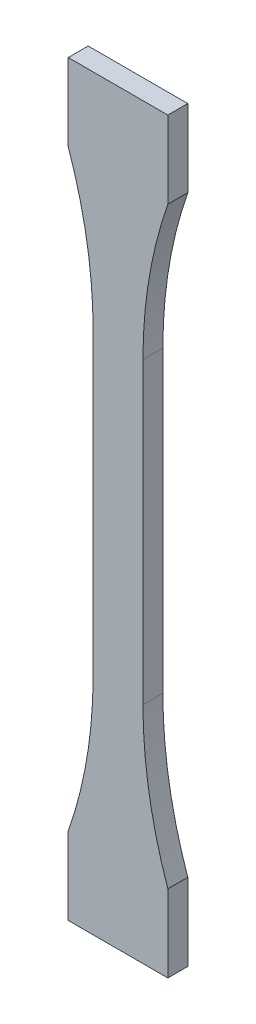
ISO-10303-21;
HEADER;
FILE_DESCRIPTION(('STEP AP214'),'2;1');
FILE_NAME('part.step','',(''),(''),'','','');
FILE_SCHEMA(('AUTOMOTIVE_DESIGN { 1 0 10303 214 1 1 1 1 }'));
ENDSEC;
DATA;
#1=APPLICATION_CONTEXT('core data for automotive mechanical design processes');
#2=APPLICATION_PROTOCOL_DEFINITION('international standard','automotive_design',2000,#1);
#3=PRODUCT_CONTEXT('',#1,'mechanical');
#4=PRODUCT('Part','Part','',(#3));
#5=PRODUCT_RELATED_PRODUCT_CATEGORY('part','',(#4));
#6=PRODUCT_DEFINITION_FORMATION('','',#4);
#7=PRODUCT_DEFINITION_CONTEXT('part definition',#1,'design');
#8=PRODUCT_DEFINITION('design','',#6,#7);
#9=PRODUCT_DEFINITION_SHAPE('','',#8);
#10=(LENGTH_UNIT() NAMED_UNIT(*) SI_UNIT(.MILLI.,.METRE.));
#11=(NAMED_UNIT(*) PLANE_ANGLE_UNIT() SI_UNIT($,.RADIAN.));
#12=(NAMED_UNIT(*) SI_UNIT($,.STERADIAN.) SOLID_ANGLE_UNIT());
#13=UNCERTAINTY_MEASURE_WITH_UNIT(LENGTH_MEASURE(1.E-05),#10,'distance_accuracy_value','');
#14=(GEOMETRIC_REPRESENTATION_CONTEXT(3) GLOBAL_UNCERTAINTY_ASSIGNED_CONTEXT((#13)) GLOBAL_UNIT_ASSIGNED_CONTEXT((#10,
#11,#12)) REPRESENTATION_CONTEXT('',''));
#15=CARTESIAN_POINT('',(0.,0.,0.));
#16=DIRECTION('',(0.,0.,1.));
#17=DIRECTION('',(1.,0.,0.));
#18=AXIS2_PLACEMENT_3D('',#15,#16,#17);
#19=CARTESIAN_POINT('',(-94.525,30.,4.));
#20=DIRECTION('',(0.,0.,-1.));
#21=DIRECTION('',(-1.,0.,0.));
#22=AXIS2_PLACEMENT_3D('',#19,#20,#21);
#23=CYLINDRICAL_SURFACE('',#22,89.525);
#24=CARTESIAN_POINT('',(-94.525,30.,0.));
#25=DIRECTION('',(0.,0.,1.));
#26=DIRECTION('',(1.,0.,0.));
#27=AXIS2_PLACEMENT_3D('',#24,#25,#26);
#28=CIRCLE('',#27,89.525);
#29=CARTESIAN_POINT('',(-5.,30.,0.));
#30=VERTEX_POINT('',#29);
#31=CARTESIAN_POINT('',(-10.,59.5,0.));
#32=VERTEX_POINT('',#31);
#33=EDGE_CURVE('E156',#30,#32,#28,.T.);
#34=ORIENTED_EDGE('',*,*,#33,.F.);
#35=DIRECTION('',(0.,0.,-1.));
#36=VECTOR('',#35,1.);
#37=CARTESIAN_POINT('',(-5.,30.,4.));
#38=LINE('',#37,#36);
#39=CARTESIAN_POINT('',(-5.,30.,4.));
#40=VERTEX_POINT('',#39);
#41=EDGE_CURVE('E11',#40,#30,#38,.T.);
#42=ORIENTED_EDGE('',*,*,#41,.F.);
#43=CARTESIAN_POINT('',(-94.525,30.,4.));
#44=DIRECTION('',(0.,0.,1.));
#45=DIRECTION('',(1.,0.,0.));
#46=AXIS2_PLACEMENT_3D('',#43,#44,#45);
#47=CIRCLE('',#46,89.525);
#48=CARTESIAN_POINT('',(-10.,59.5,4.));
#49=VERTEX_POINT('',#48);
#50=EDGE_CURVE('E187',#40,#49,#47,.T.);
#51=ORIENTED_EDGE('',*,*,#50,.T.);
#52=DIRECTION('',(0.,0.,-1.));
#53=VECTOR('',#52,1.);
#54=CARTESIAN_POINT('',(-10.,59.5,4.));
#55=LINE('',#54,#53);
#56=EDGE_CURVE('E100',#49,#32,#55,.T.);
#57=ORIENTED_EDGE('',*,*,#56,.T.);
#58=EDGE_LOOP('',(#34,#42,#51,#57));
#59=FACE_BOUND('',#58,.T.);
#60=ADVANCED_FACE('F38',(#59),#23,.F.);
#61=CARTESIAN_POINT('',(-5.,0.,4.));
#62=DIRECTION('',(1.,0.,0.));
#63=DIRECTION('',(0.,0.,-1.));
#64=AXIS2_PLACEMENT_3D('',#61,#62,#63);
#65=PLANE('',#64);
#66=DIRECTION('',(0.,-1.,0.));
#67=VECTOR('',#66,1.);
#68=CARTESIAN_POINT('',(-5.,0.,0.));
#69=LINE('',#68,#67);
#70=CARTESIAN_POINT('',(-5.,-30.,0.));
#71=VERTEX_POINT('',#70);
#72=EDGE_CURVE('E159',#30,#71,#69,.T.);
#73=ORIENTED_EDGE('',*,*,#72,.T.);
#74=DIRECTION('',(0.,0.,-1.));
#75=VECTOR('',#74,1.);
#76=CARTESIAN_POINT('',(-5.,-30.,4.));
#77=LINE('',#76,#75);
#78=CARTESIAN_POINT('',(-5.,-30.,4.));
#79=VERTEX_POINT('',#78);
#80=EDGE_CURVE('E46',#79,#71,#77,.T.);
#81=ORIENTED_EDGE('',*,*,#80,.F.);
#82=DIRECTION('',(0.,-1.,0.));
#83=VECTOR('',#82,1.);
#84=CARTESIAN_POINT('',(-5.,0.,4.));
#85=LINE('',#84,#83);
#86=EDGE_CURVE('E264',#40,#79,#85,.T.);
#87=ORIENTED_EDGE('',*,*,#86,.F.);
#88=ORIENTED_EDGE('',*,*,#41,.T.);
#89=EDGE_LOOP('',(#73,#81,#87,#88));
#90=FACE_BOUND('',#89,.T.);
#91=ADVANCED_FACE('F212',(#90),#65,.F.);
#92=CARTESIAN_POINT('',(-94.525,-30.,4.));
#93=DIRECTION('',(0.,0.,-1.));
#94=DIRECTION('',(-1.,0.,0.));
#95=AXIS2_PLACEMENT_3D('',#92,#93,#94);
#96=CYLINDRICAL_SURFACE('',#95,89.525);
#97=CARTESIAN_POINT('',(-94.525,-30.,0.));
#98=DIRECTION('',(0.,0.,1.));
#99=DIRECTION('',(1.,0.,0.));
#100=AXIS2_PLACEMENT_3D('',#97,#98,#99);
#101=CIRCLE('',#100,89.525);
#102=CARTESIAN_POINT('',(-9.99999999999998,-59.5,0.));
#103=VERTEX_POINT('',#102);
#104=EDGE_CURVE('E162',#103,#71,#101,.T.);
#105=ORIENTED_EDGE('',*,*,#104,.F.);
#106=DIRECTION('',(0.,0.,-1.));
#107=VECTOR('',#106,1.);
#108=CARTESIAN_POINT('',(-9.99999999999998,-59.5,4.));
#109=LINE('',#108,#107);
#110=CARTESIAN_POINT('',(-9.99999999999998,-59.5,4.));
#111=VERTEX_POINT('',#110);
#112=EDGE_CURVE('E202',#111,#103,#109,.T.);
#113=ORIENTED_EDGE('',*,*,#112,.F.);
#114=CARTESIAN_POINT('',(-94.525,-30.,4.));
#115=DIRECTION('',(0.,0.,1.));
#116=DIRECTION('',(1.,0.,0.));
#117=AXIS2_PLACEMENT_3D('',#114,#115,#116);
#118=CIRCLE('',#117,89.525);
#119=EDGE_CURVE('E209',#111,#79,#118,.T.);
#120=ORIENTED_EDGE('',*,*,#119,.T.);
#121=ORIENTED_EDGE('',*,*,#80,.T.);
#122=EDGE_LOOP('',(#105,#113,#120,#121));
#123=FACE_BOUND('',#122,.T.);
#124=ADVANCED_FACE('F207',(#123),#96,.F.);
#125=CARTESIAN_POINT('',(-9.99999999999994,0.,4.));
#126=DIRECTION('',(1.,0.,0.));
#127=DIRECTION('',(0.,1.,0.));
#128=AXIS2_PLACEMENT_3D('',#125,#126,#127);
#129=PLANE('',#128);
#130=DIRECTION('',(0.,-1.,0.));
#131=VECTOR('',#130,1.);
#132=CARTESIAN_POINT('',(-9.99999999999994,0.,0.));
#133=LINE('',#132,#131);
#134=CARTESIAN_POINT('',(-9.99999999999999,-75.,0.));
#135=VERTEX_POINT('',#134);
#136=EDGE_CURVE('E165',#103,#135,#133,.T.);
#137=ORIENTED_EDGE('',*,*,#136,.T.);
#138=DIRECTION('',(0.,0.,-1.));
#139=VECTOR('',#138,1.);
#140=CARTESIAN_POINT('',(-9.99999999999999,-75.,4.));
#141=LINE('',#140,#139);
#142=CARTESIAN_POINT('',(-9.99999999999999,-75.,4.));
#143=VERTEX_POINT('',#142);
#144=EDGE_CURVE('E199',#143,#135,#141,.T.);
#145=ORIENTED_EDGE('',*,*,#144,.F.);
#146=DIRECTION('',(0.,-1.,0.));
#147=VECTOR('',#146,1.);
#148=CARTESIAN_POINT('',(-9.99999999999994,0.,4.));
#149=LINE('',#148,#147);
#150=EDGE_CURVE('E229',#111,#143,#149,.T.);
#151=ORIENTED_EDGE('',*,*,#150,.F.);
#152=ORIENTED_EDGE('',*,*,#112,.T.);
#153=EDGE_LOOP('',(#137,#145,#151,#152));
#154=FACE_BOUND('',#153,.T.);
#155=ADVANCED_FACE('F219',(#154),#129,.F.);
#156=CARTESIAN_POINT('',(0.,-75.,4.));
#157=DIRECTION('',(0.,1.,0.));
#158=DIRECTION('',(0.,0.,1.));
#159=AXIS2_PLACEMENT_3D('',#156,#157,#158);
#160=PLANE('',#159);
#161=DIRECTION('',(1.,0.,0.));
#162=VECTOR('',#161,1.);
#163=CARTESIAN_POINT('',(0.,-75.,0.));
#164=LINE('',#163,#162);
#165=CARTESIAN_POINT('',(10.,-75.,0.));
#166=VERTEX_POINT('',#165);
#167=EDGE_CURVE('E167',#135,#166,#164,.T.);
#168=ORIENTED_EDGE('',*,*,#167,.T.);
#169=DIRECTION('',(0.,0.,-1.));
#170=VECTOR('',#169,1.);
#171=CARTESIAN_POINT('',(10.,-75.,4.));
#172=LINE('',#171,#170);
#173=CARTESIAN_POINT('',(10.,-75.,4.));
#174=VERTEX_POINT('',#173);
#175=EDGE_CURVE('E197',#174,#166,#172,.T.);
#176=ORIENTED_EDGE('',*,*,#175,.F.);
#177=DIRECTION('',(1.,0.,0.));
#178=VECTOR('',#177,1.);
#179=CARTESIAN_POINT('',(0.,-75.,4.));
#180=LINE('',#179,#178);
#181=EDGE_CURVE('E225',#143,#174,#180,.T.);
#182=ORIENTED_EDGE('',*,*,#181,.F.);
#183=ORIENTED_EDGE('',*,*,#144,.T.);
#184=EDGE_LOOP('',(#168,#176,#182,#183));
#185=FACE_BOUND('',#184,.T.);
#186=ADVANCED_FACE('F223',(#185),#160,.F.);
#187=CARTESIAN_POINT('',(10.0000000000001,0.,4.));
#188=DIRECTION('',(1.,0.,0.));
#189=DIRECTION('',(0.,1.,0.));
#190=AXIS2_PLACEMENT_3D('',#187,#188,#189);
#191=PLANE('',#190);
#192=DIRECTION('',(0.,-1.,0.));
#193=VECTOR('',#192,1.);
#194=CARTESIAN_POINT('',(10.0000000000001,0.,0.));
#195=LINE('',#194,#193);
#196=CARTESIAN_POINT('',(10.,-59.5,0.));
#197=VERTEX_POINT('',#196);
#198=EDGE_CURVE('E170',#197,#166,#195,.T.);
#199=ORIENTED_EDGE('',*,*,#198,.F.);
#200=DIRECTION('',(0.,0.,-1.));
#201=VECTOR('',#200,1.);
#202=CARTESIAN_POINT('',(10.,-59.5,4.));
#203=LINE('',#202,#201);
#204=CARTESIAN_POINT('',(10.,-59.5,4.));
#205=VERTEX_POINT('',#204);
#206=EDGE_CURVE('E195',#205,#197,#203,.T.);
#207=ORIENTED_EDGE('',*,*,#206,.F.);
#208=DIRECTION('',(0.,-1.,0.));
#209=VECTOR('',#208,1.);
#210=CARTESIAN_POINT('',(10.0000000000001,0.,4.));
#211=LINE('',#210,#209);
#212=EDGE_CURVE('E228',#205,#174,#211,.T.);
#213=ORIENTED_EDGE('',*,*,#212,.T.);
#214=ORIENTED_EDGE('',*,*,#175,.T.);
#215=EDGE_LOOP('',(#199,#207,#213,#214));
#216=FACE_BOUND('',#215,.T.);
#217=ADVANCED_FACE('F321',(#216),#191,.T.);
#218=CARTESIAN_POINT('',(94.525,-30.,4.));
#219=DIRECTION('',(0.,0.,-1.));
#220=DIRECTION('',(-1.,0.,0.));
#221=AXIS2_PLACEMENT_3D('',#218,#219,#220);
#222=CYLINDRICAL_SURFACE('',#221,89.525);
#223=CARTESIAN_POINT('',(94.525,-30.,0.));
#224=DIRECTION('',(0.,0.,1.));
#225=DIRECTION('',(1.,0.,0.));
#226=AXIS2_PLACEMENT_3D('',#223,#224,#225);
#227=CIRCLE('',#226,89.525);
#228=CARTESIAN_POINT('',(5.,-30.,0.));
#229=VERTEX_POINT('',#228);
#230=EDGE_CURVE('E173',#197,#229,#227,.F.);
#231=ORIENTED_EDGE('',*,*,#230,.T.);
#232=DIRECTION('',(0.,0.,-1.));
#233=VECTOR('',#232,1.);
#234=CARTESIAN_POINT('',(5.,-30.,4.));
#235=LINE('',#234,#233);
#236=CARTESIAN_POINT('',(5.,-30.,4.));
#237=VERTEX_POINT('',#236);
#238=EDGE_CURVE('E193',#237,#229,#235,.T.);
#239=ORIENTED_EDGE('',*,*,#238,.F.);
#240=CARTESIAN_POINT('',(94.525,-30.,4.));
#241=DIRECTION('',(0.,0.,1.));
#242=DIRECTION('',(1.,0.,0.));
#243=AXIS2_PLACEMENT_3D('',#240,#241,#242);
#244=CIRCLE('',#243,89.525);
#245=EDGE_CURVE('E231',#205,#237,#244,.F.);
#246=ORIENTED_EDGE('',*,*,#245,.F.);
#247=ORIENTED_EDGE('',*,*,#206,.T.);
#248=EDGE_LOOP('',(#231,#239,#246,#247));
#249=FACE_BOUND('',#248,.T.);
#250=ADVANCED_FACE('F245',(#249),#222,.F.);
#251=CARTESIAN_POINT('',(5.,0.,4.));
#252=DIRECTION('',(1.,0.,0.));
#253=DIRECTION('',(0.,0.,-1.));
#254=AXIS2_PLACEMENT_3D('',#251,#252,#253);
#255=PLANE('',#254);
#256=DIRECTION('',(0.,-1.,0.));
#257=VECTOR('',#256,1.);
#258=CARTESIAN_POINT('',(5.,0.,0.));
#259=LINE('',#258,#257);
#260=CARTESIAN_POINT('',(5.,30.,0.));
#261=VERTEX_POINT('',#260);
#262=EDGE_CURVE('E176',#261,#229,#259,.T.);
#263=ORIENTED_EDGE('',*,*,#262,.F.);
#264=DIRECTION('',(0.,0.,-1.));
#265=VECTOR('',#264,1.);
#266=CARTESIAN_POINT('',(5.,30.,4.));
#267=LINE('',#266,#265);
#268=CARTESIAN_POINT('',(5.,30.,4.));
#269=VERTEX_POINT('',#268);
#270=EDGE_CURVE('E191',#269,#261,#267,.T.);
#271=ORIENTED_EDGE('',*,*,#270,.F.);
#272=DIRECTION('',(0.,-1.,0.));
#273=VECTOR('',#272,1.);
#274=CARTESIAN_POINT('',(5.,0.,4.));
#275=LINE('',#274,#273);
#276=EDGE_CURVE('E237',#269,#237,#275,.T.);
#277=ORIENTED_EDGE('',*,*,#276,.T.);
#278=ORIENTED_EDGE('',*,*,#238,.T.);
#279=EDGE_LOOP('',(#263,#271,#277,#278));
#280=FACE_BOUND('',#279,.T.);
#281=ADVANCED_FACE('F241',(#280),#255,.T.);
#282=CARTESIAN_POINT('',(94.525,30.,4.));
#283=DIRECTION('',(0.,0.,-1.));
#284=DIRECTION('',(-1.,0.,0.));
#285=AXIS2_PLACEMENT_3D('',#282,#283,#284);
#286=CYLINDRICAL_SURFACE('',#285,89.525);
#287=CARTESIAN_POINT('',(94.525,30.,0.));
#288=DIRECTION('',(0.,0.,1.));
#289=DIRECTION('',(1.,0.,0.));
#290=AXIS2_PLACEMENT_3D('',#287,#288,#289);
#291=CIRCLE('',#290,89.525);
#292=CARTESIAN_POINT('',(10.,59.5,0.));
#293=VERTEX_POINT('',#292);
#294=EDGE_CURVE('E179',#261,#293,#291,.F.);
#295=ORIENTED_EDGE('',*,*,#294,.T.);
#296=DIRECTION('',(0.,0.,-1.));
#297=VECTOR('',#296,1.);
#298=CARTESIAN_POINT('',(10.,59.5,4.));
#299=LINE('',#298,#297);
#300=CARTESIAN_POINT('',(10.,59.5,4.));
#301=VERTEX_POINT('',#300);
#302=EDGE_CURVE('E142',#301,#293,#299,.T.);
#303=ORIENTED_EDGE('',*,*,#302,.F.);
#304=CARTESIAN_POINT('',(94.525,30.,4.));
#305=DIRECTION('',(0.,0.,1.));
#306=DIRECTION('',(1.,0.,0.));
#307=AXIS2_PLACEMENT_3D('',#304,#305,#306);
#308=CIRCLE('',#307,89.525);
#309=EDGE_CURVE('E148',#269,#301,#308,.F.);
#310=ORIENTED_EDGE('',*,*,#309,.F.);
#311=ORIENTED_EDGE('',*,*,#270,.T.);
#312=EDGE_LOOP('',(#295,#303,#310,#311));
#313=FACE_BOUND('',#312,.T.);
#314=ADVANCED_FACE('F250',(#313),#286,.F.);
#315=CARTESIAN_POINT('',(10.0000000000001,0.,4.));
#316=DIRECTION('',(1.,0.,0.));
#317=DIRECTION('',(0.,1.,0.));
#318=AXIS2_PLACEMENT_3D('',#315,#316,#317);
#319=PLANE('',#318);
#320=DIRECTION('',(0.,-1.,0.));
#321=VECTOR('',#320,1.);
#322=CARTESIAN_POINT('',(10.0000000000001,0.,0.));
#323=LINE('',#322,#321);
#324=CARTESIAN_POINT('',(10.,75.,0.));
#325=VERTEX_POINT('',#324);
#326=EDGE_CURVE('E137',#325,#293,#323,.T.);
#327=ORIENTED_EDGE('',*,*,#326,.F.);
#328=DIRECTION('',(0.,0.,-1.));
#329=VECTOR('',#328,1.);
#330=CARTESIAN_POINT('',(10.,75.,4.));
#331=LINE('',#330,#329);
#332=CARTESIAN_POINT('',(10.,75.,4.));
#333=VERTEX_POINT('',#332);
#334=EDGE_CURVE('E132',#333,#325,#331,.T.);
#335=ORIENTED_EDGE('',*,*,#334,.F.);
#336=DIRECTION('',(0.,-1.,0.));
#337=VECTOR('',#336,1.);
#338=CARTESIAN_POINT('',(10.0000000000001,0.,4.));
#339=LINE('',#338,#337);
#340=EDGE_CURVE('E135',#333,#301,#339,.T.);
#341=ORIENTED_EDGE('',*,*,#340,.T.);
#342=ORIENTED_EDGE('',*,*,#302,.T.);
#343=EDGE_LOOP('',(#327,#335,#341,#342));
#344=FACE_BOUND('',#343,.T.);
#345=ADVANCED_FACE('F134',(#344),#319,.T.);
#346=CARTESIAN_POINT('',(0.,75.,4.));
#347=DIRECTION('',(0.,1.,0.));
#348=DIRECTION('',(0.,0.,1.));
#349=AXIS2_PLACEMENT_3D('',#346,#347,#348);
#350=PLANE('',#349);
#351=DIRECTION('',(1.,0.,0.));
#352=VECTOR('',#351,1.);
#353=CARTESIAN_POINT('',(0.,75.,0.));
#354=LINE('',#353,#352);
#355=CARTESIAN_POINT('',(-9.99999999999999,75.,0.));
#356=VERTEX_POINT('',#355);
#357=EDGE_CURVE('E183',#356,#325,#354,.T.);
#358=ORIENTED_EDGE('',*,*,#357,.F.);
#359=DIRECTION('',(0.,0.,-1.));
#360=VECTOR('',#359,1.);
#361=CARTESIAN_POINT('',(-9.99999999999999,75.,4.));
#362=LINE('',#361,#360);
#363=CARTESIAN_POINT('',(-9.99999999999999,75.,4.));
#364=VERTEX_POINT('',#363);
#365=EDGE_CURVE('E93',#364,#356,#362,.T.);
#366=ORIENTED_EDGE('',*,*,#365,.F.);
#367=DIRECTION('',(1.,0.,0.));
#368=VECTOR('',#367,1.);
#369=CARTESIAN_POINT('',(0.,75.,4.));
#370=LINE('',#369,#368);
#371=EDGE_CURVE('E145',#364,#333,#370,.T.);
#372=ORIENTED_EDGE('',*,*,#371,.T.);
#373=ORIENTED_EDGE('',*,*,#334,.T.);
#374=EDGE_LOOP('',(#358,#366,#372,#373));
#375=FACE_BOUND('',#374,.T.);
#376=ADVANCED_FACE('F151',(#375),#350,.T.);
#377=CARTESIAN_POINT('',(-10.0000000000001,0.,4.));
#378=DIRECTION('',(1.,0.,0.));
#379=DIRECTION('',(0.,1.,0.));
#380=AXIS2_PLACEMENT_3D('',#377,#378,#379);
#381=PLANE('',#380);
#382=DIRECTION('',(0.,-1.,0.));
#383=VECTOR('',#382,1.);
#384=CARTESIAN_POINT('',(-10.0000000000001,0.,0.));
#385=LINE('',#384,#383);
#386=EDGE_CURVE('E185',#356,#32,#385,.T.);
#387=ORIENTED_EDGE('',*,*,#386,.T.);
#388=ORIENTED_EDGE('',*,*,#56,.F.);
#389=DIRECTION('',(0.,-1.,0.));
#390=VECTOR('',#389,1.);
#391=CARTESIAN_POINT('',(-10.0000000000001,0.,4.));
#392=LINE('',#391,#390);
#393=EDGE_CURVE('E54',#364,#49,#392,.T.);
#394=ORIENTED_EDGE('',*,*,#393,.F.);
#395=ORIENTED_EDGE('',*,*,#365,.T.);
#396=EDGE_LOOP('',(#387,#388,#394,#395));
#397=FACE_BOUND('',#396,.T.);
#398=ADVANCED_FACE('F263',(#397),#381,.F.);
#399=CARTESIAN_POINT('',(0.,0.,4.));
#400=DIRECTION('',(0.,0.,1.));
#401=DIRECTION('',(1.,0.,0.));
#402=AXIS2_PLACEMENT_3D('',#399,#400,#401);
#403=PLANE('',#402);
#404=ORIENTED_EDGE('',*,*,#50,.F.);
#405=ORIENTED_EDGE('',*,*,#86,.T.);
#406=ORIENTED_EDGE('',*,*,#119,.F.);
#407=ORIENTED_EDGE('',*,*,#150,.T.);
#408=ORIENTED_EDGE('',*,*,#181,.T.);
#409=ORIENTED_EDGE('',*,*,#212,.F.);
#410=ORIENTED_EDGE('',*,*,#245,.T.);
#411=ORIENTED_EDGE('',*,*,#276,.F.);
#412=ORIENTED_EDGE('',*,*,#309,.T.);
#413=ORIENTED_EDGE('',*,*,#340,.F.);
#414=ORIENTED_EDGE('',*,*,#371,.F.);
#415=ORIENTED_EDGE('',*,*,#393,.T.);
#416=EDGE_LOOP('',(#404,#405,#406,#407,#408,#409,#410,#411,#412,#413,#414,#415));
#417=FACE_BOUND('',#416,.T.);
#418=ADVANCED_FACE('F144',(#417),#403,.T.);
#419=CARTESIAN_POINT('',(0.,0.,0.));
#420=DIRECTION('',(0.,0.,1.));
#421=DIRECTION('',(1.,0.,0.));
#422=AXIS2_PLACEMENT_3D('',#419,#420,#421);
#423=PLANE('',#422);
#424=ORIENTED_EDGE('',*,*,#33,.T.);
#425=ORIENTED_EDGE('',*,*,#386,.F.);
#426=ORIENTED_EDGE('',*,*,#357,.T.);
#427=ORIENTED_EDGE('',*,*,#326,.T.);
#428=ORIENTED_EDGE('',*,*,#294,.F.);
#429=ORIENTED_EDGE('',*,*,#262,.T.);
#430=ORIENTED_EDGE('',*,*,#230,.F.);
#431=ORIENTED_EDGE('',*,*,#198,.T.);
#432=ORIENTED_EDGE('',*,*,#167,.F.);
#433=ORIENTED_EDGE('',*,*,#136,.F.);
#434=ORIENTED_EDGE('',*,*,#104,.T.);
#435=ORIENTED_EDGE('',*,*,#72,.F.);
#436=EDGE_LOOP('',(#424,#425,#426,#427,#428,#429,#430,#431,#432,#433,#434,#435));
#437=FACE_BOUND('',#436,.T.);
#438=ADVANCED_FACE('F215',(#437),#423,.F.);
#439=CLOSED_SHELL('',(#60,#91,#124,#155,#186,#217,#250,#281,#314,#345,#376,#398,#418,#438));
#440=MANIFOLD_SOLID_BREP('B2',#439);
#441=ADVANCED_BREP_SHAPE_REPRESENTATION('',(#18,#440),#14);
#442=SHAPE_DEFINITION_REPRESENTATION(#9,#441);
ENDSEC;
END-ISO-10303-21;
